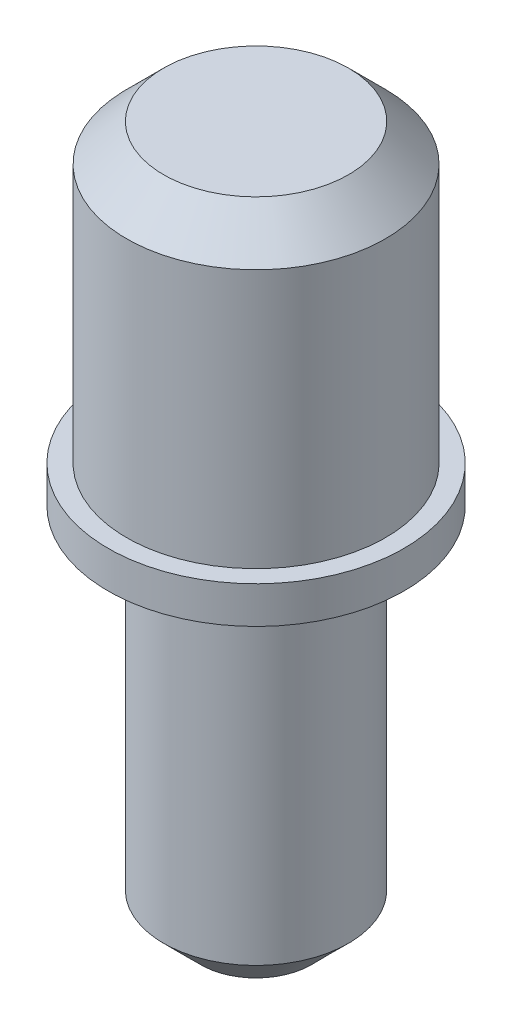
ISO-10303-21;
HEADER;
FILE_DESCRIPTION(('STEP AP214'),'2;1');
FILE_NAME('part.step','',(''),(''),'','','');
FILE_SCHEMA(('AUTOMOTIVE_DESIGN { 1 0 10303 214 1 1 1 1 }'));
ENDSEC;
DATA;
#1=APPLICATION_CONTEXT('core data for automotive mechanical design processes');
#2=APPLICATION_PROTOCOL_DEFINITION('international standard','automotive_design',2000,#1);
#3=PRODUCT_CONTEXT('',#1,'mechanical');
#4=PRODUCT('Part','Part','',(#3));
#5=PRODUCT_RELATED_PRODUCT_CATEGORY('part','',(#4));
#6=PRODUCT_DEFINITION_FORMATION('','',#4);
#7=PRODUCT_DEFINITION_CONTEXT('part definition',#1,'design');
#8=PRODUCT_DEFINITION('design','',#6,#7);
#9=PRODUCT_DEFINITION_SHAPE('','',#8);
#10=(LENGTH_UNIT() NAMED_UNIT(*) SI_UNIT(.MILLI.,.METRE.));
#11=(NAMED_UNIT(*) PLANE_ANGLE_UNIT() SI_UNIT($,.RADIAN.));
#12=(NAMED_UNIT(*) SI_UNIT($,.STERADIAN.) SOLID_ANGLE_UNIT());
#13=UNCERTAINTY_MEASURE_WITH_UNIT(LENGTH_MEASURE(1.E-05),#10,'distance_accuracy_value','');
#14=(GEOMETRIC_REPRESENTATION_CONTEXT(3) GLOBAL_UNCERTAINTY_ASSIGNED_CONTEXT((#13)) GLOBAL_UNIT_ASSIGNED_CONTEXT((#10,
#11,#12)) REPRESENTATION_CONTEXT('',''));
#15=CARTESIAN_POINT('',(0.,0.,0.));
#16=DIRECTION('',(0.,0.,1.));
#17=DIRECTION('',(1.,0.,0.));
#18=AXIS2_PLACEMENT_3D('',#15,#16,#17);
#19=CARTESIAN_POINT('',(1.5,0.,0.));
#20=DIRECTION('',(0.,-1.,0.));
#21=DIRECTION('',(0.,0.,-1.));
#22=AXIS2_PLACEMENT_3D('',#19,#20,#21);
#23=PLANE('',#22);
#24=CARTESIAN_POINT('',(0.,0.,0.));
#25=DIRECTION('',(0.,-1.,0.));
#26=DIRECTION('',(0.,0.,-1.));
#27=AXIS2_PLACEMENT_3D('',#24,#25,#26);
#28=CIRCLE('',#27,1.5);
#29=CARTESIAN_POINT('',(0.,0.,-1.5));
#30=VERTEX_POINT('',#29);
#31=EDGE_CURVE('E58',#30,#30,#28,.T.);
#32=ORIENTED_EDGE('',*,*,#31,.T.);
#33=EDGE_LOOP('',(#32));
#34=FACE_BOUND('',#33,.T.);
#35=ADVANCED_FACE('F30',(#34),#23,.T.);
#36=CARTESIAN_POINT('',(0.,19.,0.));
#37=DIRECTION('',(0.,1.,0.));
#38=DIRECTION('',(0.,0.,1.));
#39=AXIS2_PLACEMENT_3D('',#36,#37,#38);
#40=PLANE('',#39);
#41=CARTESIAN_POINT('',(0.,19.,0.));
#42=DIRECTION('',(0.,-1.,0.));
#43=DIRECTION('',(0.,0.,-1.));
#44=AXIS2_PLACEMENT_3D('',#41,#42,#43);
#45=CIRCLE('',#44,2.5);
#46=CARTESIAN_POINT('',(0.,19.,-2.5));
#47=VERTEX_POINT('',#46);
#48=EDGE_CURVE('E10',#47,#47,#45,.T.);
#49=ORIENTED_EDGE('',*,*,#48,.F.);
#50=EDGE_LOOP('',(#49));
#51=FACE_BOUND('',#50,.T.);
#52=ADVANCED_FACE('F75',(#51),#40,.T.);
#53=CARTESIAN_POINT('',(0.,18.,0.));
#54=DIRECTION('',(0.,-1.,0.));
#55=DIRECTION('',(0.,0.,-1.));
#56=AXIS2_PLACEMENT_3D('',#53,#54,#55);
#57=CONICAL_SURFACE('',#56,3.5,0.785398163397448);
#58=ORIENTED_EDGE('',*,*,#48,.T.);
#59=EDGE_LOOP('',(#58));
#60=FACE_BOUND('',#59,.T.);
#61=CARTESIAN_POINT('',(0.,18.,0.));
#62=DIRECTION('',(0.,-1.,0.));
#63=DIRECTION('',(0.,0.,-1.));
#64=AXIS2_PLACEMENT_3D('',#61,#62,#63);
#65=CIRCLE('',#64,3.5);
#66=CARTESIAN_POINT('',(0.,18.,-3.5));
#67=VERTEX_POINT('',#66);
#68=EDGE_CURVE('E36',#67,#67,#65,.T.);
#69=ORIENTED_EDGE('',*,*,#68,.F.);
#70=EDGE_LOOP('',(#69));
#71=FACE_BOUND('',#70,.T.);
#72=ADVANCED_FACE('F79',(#60,#71),#57,.T.);
#73=CARTESIAN_POINT('',(0.,0.,0.));
#74=DIRECTION('',(0.,-1.,0.));
#75=DIRECTION('',(0.,0.,-1.));
#76=AXIS2_PLACEMENT_3D('',#73,#74,#75);
#77=CYLINDRICAL_SURFACE('',#76,3.5);
#78=ORIENTED_EDGE('',*,*,#68,.T.);
#79=EDGE_LOOP('',(#78));
#80=FACE_BOUND('',#79,.T.);
#81=CARTESIAN_POINT('',(0.,11.,0.));
#82=DIRECTION('',(0.,-1.,0.));
#83=DIRECTION('',(0.,0.,-1.));
#84=AXIS2_PLACEMENT_3D('',#81,#82,#83);
#85=CIRCLE('',#84,3.5);
#86=CARTESIAN_POINT('',(0.,11.,-3.5));
#87=VERTEX_POINT('',#86);
#88=EDGE_CURVE('E40',#87,#87,#85,.T.);
#89=ORIENTED_EDGE('',*,*,#88,.F.);
#90=EDGE_LOOP('',(#89));
#91=FACE_BOUND('',#90,.T.);
#92=ADVANCED_FACE('F84',(#80,#91),#77,.T.);
#93=CARTESIAN_POINT('',(3.5,11.,0.));
#94=DIRECTION('',(0.,1.,0.));
#95=DIRECTION('',(0.,0.,1.));
#96=AXIS2_PLACEMENT_3D('',#93,#94,#95);
#97=PLANE('',#96);
#98=ORIENTED_EDGE('',*,*,#88,.T.);
#99=EDGE_LOOP('',(#98));
#100=FACE_BOUND('',#99,.T.);
#101=CARTESIAN_POINT('',(0.,11.,0.));
#102=DIRECTION('',(0.,-1.,0.));
#103=DIRECTION('',(0.,0.,-1.));
#104=AXIS2_PLACEMENT_3D('',#101,#102,#103);
#105=CIRCLE('',#104,4.);
#106=CARTESIAN_POINT('',(0.,11.,-4.));
#107=VERTEX_POINT('',#106);
#108=EDGE_CURVE('E44',#107,#107,#105,.T.);
#109=ORIENTED_EDGE('',*,*,#108,.F.);
#110=EDGE_LOOP('',(#109));
#111=FACE_BOUND('',#110,.T.);
#112=ADVANCED_FACE('F89',(#100,#111),#97,.T.);
#113=CARTESIAN_POINT('',(0.,0.,0.));
#114=DIRECTION('',(0.,-1.,0.));
#115=DIRECTION('',(0.,0.,-1.));
#116=AXIS2_PLACEMENT_3D('',#113,#114,#115);
#117=CYLINDRICAL_SURFACE('',#116,4.);
#118=ORIENTED_EDGE('',*,*,#108,.T.);
#119=EDGE_LOOP('',(#118));
#120=FACE_BOUND('',#119,.T.);
#121=CARTESIAN_POINT('',(0.,10.,0.));
#122=DIRECTION('',(0.,-1.,0.));
#123=DIRECTION('',(0.,0.,-1.));
#124=AXIS2_PLACEMENT_3D('',#121,#122,#123);
#125=CIRCLE('',#124,4.);
#126=CARTESIAN_POINT('',(0.,10.,-4.));
#127=VERTEX_POINT('',#126);
#128=EDGE_CURVE('E49',#127,#127,#125,.T.);
#129=ORIENTED_EDGE('',*,*,#128,.F.);
#130=EDGE_LOOP('',(#129));
#131=FACE_BOUND('',#130,.T.);
#132=ADVANCED_FACE('F92',(#120,#131),#117,.T.);
#133=CARTESIAN_POINT('',(4.,10.,0.));
#134=DIRECTION('',(0.,-1.,0.));
#135=DIRECTION('',(0.,0.,-1.));
#136=AXIS2_PLACEMENT_3D('',#133,#134,#135);
#137=PLANE('',#136);
#138=ORIENTED_EDGE('',*,*,#128,.T.);
#139=EDGE_LOOP('',(#138));
#140=FACE_BOUND('',#139,.T.);
#141=CARTESIAN_POINT('',(0.,10.,0.));
#142=DIRECTION('',(0.,-1.,0.));
#143=DIRECTION('',(0.,0.,-1.));
#144=AXIS2_PLACEMENT_3D('',#141,#142,#143);
#145=CIRCLE('',#144,2.5);
#146=CARTESIAN_POINT('',(0.,10.,-2.5));
#147=VERTEX_POINT('',#146);
#148=EDGE_CURVE('E52',#147,#147,#145,.T.);
#149=ORIENTED_EDGE('',*,*,#148,.F.);
#150=EDGE_LOOP('',(#149));
#151=FACE_BOUND('',#150,.T.);
#152=ADVANCED_FACE('F71',(#140,#151),#137,.T.);
#153=CARTESIAN_POINT('',(0.,0.,0.));
#154=DIRECTION('',(0.,-1.,0.));
#155=DIRECTION('',(0.,0.,-1.));
#156=AXIS2_PLACEMENT_3D('',#153,#154,#155);
#157=CYLINDRICAL_SURFACE('',#156,2.5);
#158=ORIENTED_EDGE('',*,*,#148,.T.);
#159=EDGE_LOOP('',(#158));
#160=FACE_BOUND('',#159,.T.);
#161=CARTESIAN_POINT('',(0.,0.999999999999997,0.));
#162=DIRECTION('',(0.,-1.,0.));
#163=DIRECTION('',(0.,0.,-1.));
#164=AXIS2_PLACEMENT_3D('',#161,#162,#163);
#165=CIRCLE('',#164,2.5);
#166=CARTESIAN_POINT('',(0.,0.999999999999997,-2.5));
#167=VERTEX_POINT('',#166);
#168=EDGE_CURVE('E55',#167,#167,#165,.T.);
#169=ORIENTED_EDGE('',*,*,#168,.F.);
#170=EDGE_LOOP('',(#169));
#171=FACE_BOUND('',#170,.T.);
#172=ADVANCED_FACE('F65',(#160,#171),#157,.T.);
#173=CARTESIAN_POINT('',(0.,0.,0.));
#174=DIRECTION('',(0.,1.,0.));
#175=DIRECTION('',(0.,0.,1.));
#176=AXIS2_PLACEMENT_3D('',#173,#174,#175);
#177=CONICAL_SURFACE('',#176,1.5,0.785398163397449);
#178=ORIENTED_EDGE('',*,*,#168,.T.);
#179=EDGE_LOOP('',(#178));
#180=FACE_BOUND('',#179,.T.);
#181=ORIENTED_EDGE('',*,*,#31,.F.);
#182=EDGE_LOOP('',(#181));
#183=FACE_BOUND('',#182,.T.);
#184=ADVANCED_FACE('F63',(#180,#183),#177,.T.);
#185=CLOSED_SHELL('',(#35,#52,#72,#92,#112,#132,#152,#172,#184));
#186=MANIFOLD_SOLID_BREP('B2',#185);
#187=ADVANCED_BREP_SHAPE_REPRESENTATION('',(#18,#186),#14);
#188=SHAPE_DEFINITION_REPRESENTATION(#9,#187);
ENDSEC;
END-ISO-10303-21;
